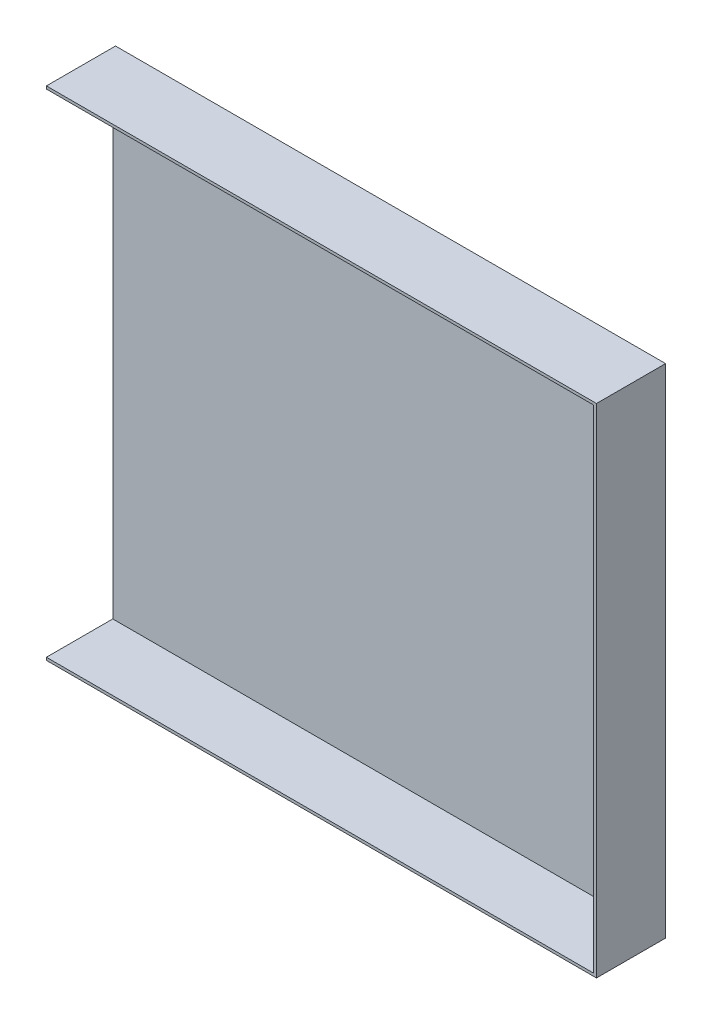
ISO-10303-21;
HEADER;
FILE_DESCRIPTION(('STEP AP214'),'2;1');
FILE_NAME('part.step','',(''),(''),'','','');
FILE_SCHEMA(('AUTOMOTIVE_DESIGN { 1 0 10303 214 1 1 1 1 }'));
ENDSEC;
DATA;
#1=APPLICATION_CONTEXT('core data for automotive mechanical design processes');
#2=APPLICATION_PROTOCOL_DEFINITION('international standard','automotive_design',2000,#1);
#3=PRODUCT_CONTEXT('',#1,'mechanical');
#4=PRODUCT('Part','Part','',(#3));
#5=PRODUCT_RELATED_PRODUCT_CATEGORY('part','',(#4));
#6=PRODUCT_DEFINITION_FORMATION('','',#4);
#7=PRODUCT_DEFINITION_CONTEXT('part definition',#1,'design');
#8=PRODUCT_DEFINITION('design','',#6,#7);
#9=PRODUCT_DEFINITION_SHAPE('','',#8);
#10=(LENGTH_UNIT() NAMED_UNIT(*) SI_UNIT(.MILLI.,.METRE.));
#11=(NAMED_UNIT(*) PLANE_ANGLE_UNIT() SI_UNIT($,.RADIAN.));
#12=(NAMED_UNIT(*) SI_UNIT($,.STERADIAN.) SOLID_ANGLE_UNIT());
#13=UNCERTAINTY_MEASURE_WITH_UNIT(LENGTH_MEASURE(1.E-05),#10,'distance_accuracy_value','');
#14=(GEOMETRIC_REPRESENTATION_CONTEXT(3) GLOBAL_UNCERTAINTY_ASSIGNED_CONTEXT((#13)) GLOBAL_UNIT_ASSIGNED_CONTEXT((#10,
#11,#12)) REPRESENTATION_CONTEXT('',''));
#15=CARTESIAN_POINT('',(0.,0.,0.));
#16=DIRECTION('',(0.,0.,1.));
#17=DIRECTION('',(1.,0.,0.));
#18=AXIS2_PLACEMENT_3D('',#15,#16,#17);
#19=CARTESIAN_POINT('',(-200.,180.,50.));
#20=DIRECTION('',(0.,-1.,0.));
#21=DIRECTION('',(0.,0.,-1.));
#22=AXIS2_PLACEMENT_3D('',#19,#20,#21);
#23=PLANE('',#22);
#24=DIRECTION('',(0.,0.,-1.));
#25=VECTOR('',#24,1.);
#26=CARTESIAN_POINT('',(-198.,180.,788.078455843583));
#27=LINE('',#26,#25);
#28=CARTESIAN_POINT('',(-198.,180.,50.0000000000003));
#29=VERTEX_POINT('',#28);
#30=CARTESIAN_POINT('',(-198.,180.,1.11022302462516E-13));
#31=VERTEX_POINT('',#30);
#32=EDGE_CURVE('E109',#29,#31,#27,.T.);
#33=ORIENTED_EDGE('',*,*,#32,.F.);
#34=DIRECTION('',(-1.,0.,0.));
#35=VECTOR('',#34,1.);
#36=CARTESIAN_POINT('',(-200.,180.,50.));
#37=LINE('',#36,#35);
#38=CARTESIAN_POINT('',(200.,180.,50.));
#39=VERTEX_POINT('',#38);
#40=EDGE_CURVE('E135',#39,#29,#37,.T.);
#41=ORIENTED_EDGE('',*,*,#40,.F.);
#42=DIRECTION('',(0.,0.,-1.));
#43=VECTOR('',#42,1.);
#44=CARTESIAN_POINT('',(200.,180.,50.));
#45=LINE('',#44,#43);
#46=CARTESIAN_POINT('',(200.,180.,0.));
#47=VERTEX_POINT('',#46);
#48=EDGE_CURVE('E11',#39,#47,#45,.T.);
#49=ORIENTED_EDGE('',*,*,#48,.T.);
#50=DIRECTION('',(-1.,0.,0.));
#51=VECTOR('',#50,1.);
#52=CARTESIAN_POINT('',(-200.,180.,0.));
#53=LINE('',#52,#51);
#54=EDGE_CURVE('E65',#47,#31,#53,.T.);
#55=ORIENTED_EDGE('',*,*,#54,.T.);
#56=EDGE_LOOP('',(#33,#41,#49,#55));
#57=FACE_BOUND('',#56,.T.);
#58=ADVANCED_FACE('F36',(#57),#23,.F.);
#59=CARTESIAN_POINT('',(200.,180.,50.));
#60=DIRECTION('',(-1.,0.,0.));
#61=DIRECTION('',(0.,-1.,0.));
#62=AXIS2_PLACEMENT_3D('',#59,#60,#61);
#63=PLANE('',#62);
#64=DIRECTION('',(0.,1.,0.));
#65=VECTOR('',#64,1.);
#66=CARTESIAN_POINT('',(200.,180.,0.));
#67=LINE('',#66,#65);
#68=CARTESIAN_POINT('',(200.,-180.,0.));
#69=VERTEX_POINT('',#68);
#70=EDGE_CURVE('E125',#69,#47,#67,.T.);
#71=ORIENTED_EDGE('',*,*,#70,.T.);
#72=ORIENTED_EDGE('',*,*,#48,.F.);
#73=DIRECTION('',(0.,1.,0.));
#74=VECTOR('',#73,1.);
#75=CARTESIAN_POINT('',(200.,180.,50.));
#76=LINE('',#75,#74);
#77=CARTESIAN_POINT('',(200.,-180.,50.));
#78=VERTEX_POINT('',#77);
#79=EDGE_CURVE('E127',#78,#39,#76,.T.);
#80=ORIENTED_EDGE('',*,*,#79,.F.);
#81=DIRECTION('',(0.,0.,-1.));
#82=VECTOR('',#81,1.);
#83=CARTESIAN_POINT('',(200.,-180.,50.));
#84=LINE('',#83,#82);
#85=EDGE_CURVE('E45',#78,#69,#84,.T.);
#86=ORIENTED_EDGE('',*,*,#85,.T.);
#87=EDGE_LOOP('',(#71,#72,#80,#86));
#88=FACE_BOUND('',#87,.T.);
#89=ADVANCED_FACE('F38',(#88),#63,.F.);
#90=CARTESIAN_POINT('',(-200.,-180.,50.));
#91=DIRECTION('',(0.,1.,0.));
#92=DIRECTION('',(0.,0.,1.));
#93=AXIS2_PLACEMENT_3D('',#90,#91,#92);
#94=PLANE('',#93);
#95=ORIENTED_EDGE('',*,*,#85,.F.);
#96=DIRECTION('',(1.,0.,0.));
#97=VECTOR('',#96,1.);
#98=CARTESIAN_POINT('',(-200.,-180.,50.));
#99=LINE('',#98,#97);
#100=CARTESIAN_POINT('',(-198.,-180.,50.0000000000003));
#101=VERTEX_POINT('',#100);
#102=EDGE_CURVE('E53',#101,#78,#99,.T.);
#103=ORIENTED_EDGE('',*,*,#102,.F.);
#104=DIRECTION('',(0.,0.,-1.));
#105=VECTOR('',#104,1.);
#106=CARTESIAN_POINT('',(-198.,-180.,788.078455843583));
#107=LINE('',#106,#105);
#108=CARTESIAN_POINT('',(-198.,-180.,1.11022302462516E-13));
#109=VERTEX_POINT('',#108);
#110=EDGE_CURVE('E117',#101,#109,#107,.T.);
#111=ORIENTED_EDGE('',*,*,#110,.T.);
#112=DIRECTION('',(1.,0.,0.));
#113=VECTOR('',#112,1.);
#114=CARTESIAN_POINT('',(-200.,-180.,0.));
#115=LINE('',#114,#113);
#116=EDGE_CURVE('E121',#109,#69,#115,.T.);
#117=ORIENTED_EDGE('',*,*,#116,.T.);
#118=EDGE_LOOP('',(#95,#103,#111,#117));
#119=FACE_BOUND('',#118,.T.);
#120=ADVANCED_FACE('F181',(#119),#94,.F.);
#121=CARTESIAN_POINT('',(0.,0.,50.));
#122=DIRECTION('',(0.,0.,1.));
#123=DIRECTION('',(1.,0.,0.));
#124=AXIS2_PLACEMENT_3D('',#121,#122,#123);
#125=PLANE('',#124);
#126=DIRECTION('',(0.,1.,0.));
#127=VECTOR('',#126,1.);
#128=CARTESIAN_POINT('',(-198.,180.,50.));
#129=LINE('',#128,#127);
#130=CARTESIAN_POINT('',(-198.,-178.,50.));
#131=VERTEX_POINT('',#130);
#132=EDGE_CURVE('E165',#101,#131,#129,.T.);
#133=ORIENTED_EDGE('',*,*,#132,.F.);
#134=ORIENTED_EDGE('',*,*,#102,.T.);
#135=ORIENTED_EDGE('',*,*,#79,.T.);
#136=ORIENTED_EDGE('',*,*,#40,.T.);
#137=CARTESIAN_POINT('',(-198.,178.,50.));
#138=VERTEX_POINT('',#137);
#139=EDGE_CURVE('E114',#138,#29,#129,.T.);
#140=ORIENTED_EDGE('',*,*,#139,.F.);
#141=DIRECTION('',(-1.,0.,0.));
#142=VECTOR('',#141,1.);
#143=CARTESIAN_POINT('',(-200.,178.,50.));
#144=LINE('',#143,#142);
#145=CARTESIAN_POINT('',(198.,178.,50.));
#146=VERTEX_POINT('',#145);
#147=EDGE_CURVE('E141',#146,#138,#144,.T.);
#148=ORIENTED_EDGE('',*,*,#147,.F.);
#149=DIRECTION('',(0.,1.,0.));
#150=VECTOR('',#149,1.);
#151=CARTESIAN_POINT('',(198.,180.,50.));
#152=LINE('',#151,#150);
#153=CARTESIAN_POINT('',(198.,-178.,50.));
#154=VERTEX_POINT('',#153);
#155=EDGE_CURVE('E144',#154,#146,#152,.T.);
#156=ORIENTED_EDGE('',*,*,#155,.F.);
#157=DIRECTION('',(1.,0.,0.));
#158=VECTOR('',#157,1.);
#159=CARTESIAN_POINT('',(-200.,-178.,50.));
#160=LINE('',#159,#158);
#161=EDGE_CURVE('E73',#131,#154,#160,.T.);
#162=ORIENTED_EDGE('',*,*,#161,.F.);
#163=EDGE_LOOP('',(#133,#134,#135,#136,#140,#148,#156,#162));
#164=FACE_BOUND('',#163,.T.);
#165=ADVANCED_FACE('F170',(#164),#125,.T.);
#166=CARTESIAN_POINT('',(0.,0.,0.));
#167=DIRECTION('',(0.,0.,1.));
#168=DIRECTION('',(1.,0.,0.));
#169=AXIS2_PLACEMENT_3D('',#166,#167,#168);
#170=PLANE('',#169);
#171=ORIENTED_EDGE('',*,*,#116,.F.);
#172=DIRECTION('',(0.,1.,0.));
#173=VECTOR('',#172,1.);
#174=CARTESIAN_POINT('',(-198.,180.,0.));
#175=LINE('',#174,#173);
#176=EDGE_CURVE('E111',#109,#31,#175,.T.);
#177=ORIENTED_EDGE('',*,*,#176,.T.);
#178=ORIENTED_EDGE('',*,*,#54,.F.);
#179=ORIENTED_EDGE('',*,*,#70,.F.);
#180=EDGE_LOOP('',(#171,#177,#178,#179));
#181=FACE_BOUND('',#180,.T.);
#182=ADVANCED_FACE('F120',(#181),#170,.F.);
#183=CARTESIAN_POINT('',(198.,180.,50.));
#184=DIRECTION('',(-1.,0.,0.));
#185=DIRECTION('',(0.,-1.,0.));
#186=AXIS2_PLACEMENT_3D('',#183,#184,#185);
#187=PLANE('',#186);
#188=DIRECTION('',(0.,1.,0.));
#189=VECTOR('',#188,1.);
#190=CARTESIAN_POINT('',(198.,180.,2.));
#191=LINE('',#190,#189);
#192=CARTESIAN_POINT('',(198.,-178.,2.));
#193=VERTEX_POINT('',#192);
#194=CARTESIAN_POINT('',(198.,178.,2.));
#195=VERTEX_POINT('',#194);
#196=EDGE_CURVE('E159',#193,#195,#191,.T.);
#197=ORIENTED_EDGE('',*,*,#196,.F.);
#198=DIRECTION('',(0.,0.,-1.));
#199=VECTOR('',#198,1.);
#200=CARTESIAN_POINT('',(198.,-178.,50.));
#201=LINE('',#200,#199);
#202=EDGE_CURVE('E140',#154,#193,#201,.T.);
#203=ORIENTED_EDGE('',*,*,#202,.F.);
#204=ORIENTED_EDGE('',*,*,#155,.T.);
#205=DIRECTION('',(0.,0.,-1.));
#206=VECTOR('',#205,1.);
#207=CARTESIAN_POINT('',(198.,178.,50.));
#208=LINE('',#207,#206);
#209=EDGE_CURVE('E129',#146,#195,#208,.T.);
#210=ORIENTED_EDGE('',*,*,#209,.T.);
#211=EDGE_LOOP('',(#197,#203,#204,#210));
#212=FACE_BOUND('',#211,.T.);
#213=ADVANCED_FACE('F175',(#212),#187,.T.);
#214=CARTESIAN_POINT('',(-200.,178.,50.));
#215=DIRECTION('',(0.,-1.,0.));
#216=DIRECTION('',(0.,0.,-1.));
#217=AXIS2_PLACEMENT_3D('',#214,#215,#216);
#218=PLANE('',#217);
#219=DIRECTION('',(-1.,0.,0.));
#220=VECTOR('',#219,1.);
#221=CARTESIAN_POINT('',(-200.,178.,2.));
#222=LINE('',#221,#220);
#223=CARTESIAN_POINT('',(-198.,178.,2.));
#224=VERTEX_POINT('',#223);
#225=EDGE_CURVE('E154',#195,#224,#222,.T.);
#226=ORIENTED_EDGE('',*,*,#225,.F.);
#227=ORIENTED_EDGE('',*,*,#209,.F.);
#228=ORIENTED_EDGE('',*,*,#147,.T.);
#229=DIRECTION('',(0.,0.,-1.));
#230=VECTOR('',#229,1.);
#231=CARTESIAN_POINT('',(-198.,178.,50.));
#232=LINE('',#231,#230);
#233=EDGE_CURVE('E151',#138,#224,#232,.T.);
#234=ORIENTED_EDGE('',*,*,#233,.T.);
#235=EDGE_LOOP('',(#226,#227,#228,#234));
#236=FACE_BOUND('',#235,.T.);
#237=ADVANCED_FACE('F177',(#236),#218,.T.);
#238=CARTESIAN_POINT('',(-200.,-178.,50.));
#239=DIRECTION('',(0.,1.,0.));
#240=DIRECTION('',(0.,0.,1.));
#241=AXIS2_PLACEMENT_3D('',#238,#239,#240);
#242=PLANE('',#241);
#243=DIRECTION('',(1.,0.,0.));
#244=VECTOR('',#243,1.);
#245=CARTESIAN_POINT('',(-200.,-178.,2.));
#246=LINE('',#245,#244);
#247=CARTESIAN_POINT('',(-198.,-178.,2.));
#248=VERTEX_POINT('',#247);
#249=EDGE_CURVE('E146',#248,#193,#246,.T.);
#250=ORIENTED_EDGE('',*,*,#249,.F.);
#251=DIRECTION('',(0.,0.,-1.));
#252=VECTOR('',#251,1.);
#253=CARTESIAN_POINT('',(-198.,-178.,50.));
#254=LINE('',#253,#252);
#255=EDGE_CURVE('E149',#131,#248,#254,.T.);
#256=ORIENTED_EDGE('',*,*,#255,.F.);
#257=ORIENTED_EDGE('',*,*,#161,.T.);
#258=ORIENTED_EDGE('',*,*,#202,.T.);
#259=EDGE_LOOP('',(#250,#256,#257,#258));
#260=FACE_BOUND('',#259,.T.);
#261=ADVANCED_FACE('F168',(#260),#242,.T.);
#262=CARTESIAN_POINT('',(0.,0.,2.));
#263=DIRECTION('',(0.,0.,1.));
#264=DIRECTION('',(1.,0.,0.));
#265=AXIS2_PLACEMENT_3D('',#262,#263,#264);
#266=PLANE('',#265);
#267=ORIENTED_EDGE('',*,*,#196,.T.);
#268=ORIENTED_EDGE('',*,*,#225,.T.);
#269=DIRECTION('',(0.,-1.,0.));
#270=VECTOR('',#269,1.);
#271=CARTESIAN_POINT('',(-198.,180.,2.));
#272=LINE('',#271,#270);
#273=EDGE_CURVE('E148',#224,#248,#272,.T.);
#274=ORIENTED_EDGE('',*,*,#273,.T.);
#275=ORIENTED_EDGE('',*,*,#249,.T.);
#276=EDGE_LOOP('',(#267,#268,#274,#275));
#277=FACE_BOUND('',#276,.T.);
#278=ADVANCED_FACE('F179',(#277),#266,.T.);
#279=CARTESIAN_POINT('',(-198.,180.,788.078455843583));
#280=DIRECTION('',(-1.,0.,0.));
#281=DIRECTION('',(0.,-1.,0.));
#282=AXIS2_PLACEMENT_3D('',#279,#280,#281);
#283=PLANE('',#282);
#284=ORIENTED_EDGE('',*,*,#233,.F.);
#285=ORIENTED_EDGE('',*,*,#139,.T.);
#286=ORIENTED_EDGE('',*,*,#32,.T.);
#287=ORIENTED_EDGE('',*,*,#176,.F.);
#288=ORIENTED_EDGE('',*,*,#110,.F.);
#289=ORIENTED_EDGE('',*,*,#132,.T.);
#290=ORIENTED_EDGE('',*,*,#255,.T.);
#291=ORIENTED_EDGE('',*,*,#273,.F.);
#292=EDGE_LOOP('',(#284,#285,#286,#287,#288,#289,#290,#291));
#293=FACE_BOUND('',#292,.T.);
#294=ADVANCED_FACE('F110',(#293),#283,.T.);
#295=CLOSED_SHELL('',(#58,#89,#120,#165,#182,#213,#237,#261,#278,#294));
#296=MANIFOLD_SOLID_BREP('B2',#295);
#297=ADVANCED_BREP_SHAPE_REPRESENTATION('',(#18,#296),#14);
#298=SHAPE_DEFINITION_REPRESENTATION(#9,#297);
ENDSEC;
END-ISO-10303-21;
